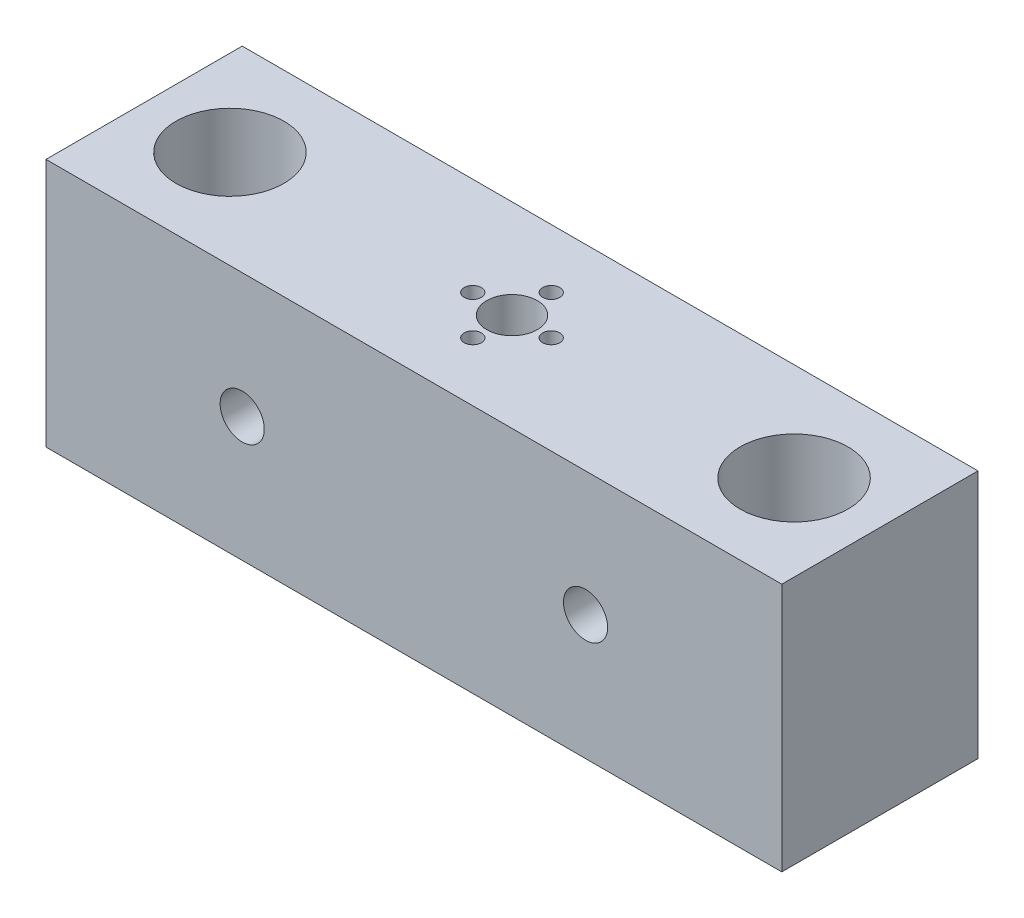
ISO-10303-21;
HEADER;
FILE_DESCRIPTION(('STEP AP214'),'2;1');
FILE_NAME('part.step','',(''),(''),'','','');
FILE_SCHEMA(('AUTOMOTIVE_DESIGN { 1 0 10303 214 1 1 1 1 }'));
ENDSEC;
DATA;
#1=APPLICATION_CONTEXT('core data for automotive mechanical design processes');
#2=APPLICATION_PROTOCOL_DEFINITION('international standard','automotive_design',2000,#1);
#3=PRODUCT_CONTEXT('',#1,'mechanical');
#4=PRODUCT('Part','Part','',(#3));
#5=PRODUCT_RELATED_PRODUCT_CATEGORY('part','',(#4));
#6=PRODUCT_DEFINITION_FORMATION('','',#4);
#7=PRODUCT_DEFINITION_CONTEXT('part definition',#1,'design');
#8=PRODUCT_DEFINITION('design','',#6,#7);
#9=PRODUCT_DEFINITION_SHAPE('','',#8);
#10=(LENGTH_UNIT() NAMED_UNIT(*) SI_UNIT(.MILLI.,.METRE.));
#11=(NAMED_UNIT(*) PLANE_ANGLE_UNIT() SI_UNIT($,.RADIAN.));
#12=(NAMED_UNIT(*) SI_UNIT($,.STERADIAN.) SOLID_ANGLE_UNIT());
#13=UNCERTAINTY_MEASURE_WITH_UNIT(LENGTH_MEASURE(1.E-05),#10,'distance_accuracy_value','');
#14=(GEOMETRIC_REPRESENTATION_CONTEXT(3) GLOBAL_UNCERTAINTY_ASSIGNED_CONTEXT((#13)) GLOBAL_UNIT_ASSIGNED_CONTEXT((#10,
#11,#12)) REPRESENTATION_CONTEXT('',''));
#15=CARTESIAN_POINT('',(0.,0.,0.));
#16=DIRECTION('',(0.,0.,1.));
#17=DIRECTION('',(1.,0.,0.));
#18=AXIS2_PLACEMENT_3D('',#15,#16,#17);
#19=CARTESIAN_POINT('',(75.,50.8,-20.));
#20=DIRECTION('',(-1.,0.,0.));
#21=DIRECTION('',(0.,0.,1.));
#22=AXIS2_PLACEMENT_3D('',#19,#20,#21);
#23=PLANE('',#22);
#24=DIRECTION('',(0.,0.,-1.));
#25=VECTOR('',#24,1.);
#26=CARTESIAN_POINT('',(75.,0.,-20.));
#27=LINE('',#26,#25);
#28=CARTESIAN_POINT('',(75.,0.,20.));
#29=VERTEX_POINT('',#28);
#30=CARTESIAN_POINT('',(75.,0.,-20.));
#31=VERTEX_POINT('',#30);
#32=EDGE_CURVE('E102',#29,#31,#27,.T.);
#33=ORIENTED_EDGE('',*,*,#32,.T.);
#34=DIRECTION('',(0.,-1.,0.));
#35=VECTOR('',#34,1.);
#36=CARTESIAN_POINT('',(75.,50.8,-20.));
#37=LINE('',#36,#35);
#38=CARTESIAN_POINT('',(75.,50.8,-20.));
#39=VERTEX_POINT('',#38);
#40=EDGE_CURVE('E11',#39,#31,#37,.T.);
#41=ORIENTED_EDGE('',*,*,#40,.F.);
#42=DIRECTION('',(0.,0.,-1.));
#43=VECTOR('',#42,1.);
#44=CARTESIAN_POINT('',(75.,50.8,-20.));
#45=LINE('',#44,#43);
#46=CARTESIAN_POINT('',(75.,50.8,20.));
#47=VERTEX_POINT('',#46);
#48=EDGE_CURVE('E90',#47,#39,#45,.T.);
#49=ORIENTED_EDGE('',*,*,#48,.F.);
#50=DIRECTION('',(0.,-1.,0.));
#51=VECTOR('',#50,1.);
#52=CARTESIAN_POINT('',(75.,50.8,20.));
#53=LINE('',#52,#51);
#54=EDGE_CURVE('E98',#47,#29,#53,.T.);
#55=ORIENTED_EDGE('',*,*,#54,.T.);
#56=EDGE_LOOP('',(#33,#41,#49,#55));
#57=FACE_BOUND('',#56,.T.);
#58=ADVANCED_FACE('F39',(#57),#23,.F.);
#59=CARTESIAN_POINT('',(-75.,50.8,-20.));
#60=DIRECTION('',(0.,0.,1.));
#61=DIRECTION('',(1.,0.,0.));
#62=AXIS2_PLACEMENT_3D('',#59,#60,#61);
#63=PLANE('',#62);
#64=CARTESIAN_POINT('',(-35.,25.4,-20.));
#65=DIRECTION('',(0.,0.,-1.));
#66=DIRECTION('',(-1.,0.,0.));
#67=AXIS2_PLACEMENT_3D('',#64,#65,#66);
#68=CIRCLE('',#67,5.025);
#69=CARTESIAN_POINT('',(-40.025,25.4,-20.));
#70=VERTEX_POINT('',#69);
#71=EDGE_CURVE('E172',#70,#70,#68,.T.);
#72=ORIENTED_EDGE('',*,*,#71,.F.);
#73=EDGE_LOOP('',(#72));
#74=FACE_BOUND('',#73,.T.);
#75=CARTESIAN_POINT('',(35.,25.4,-20.));
#76=DIRECTION('',(0.,0.,-1.));
#77=DIRECTION('',(-1.,0.,0.));
#78=AXIS2_PLACEMENT_3D('',#75,#76,#77);
#79=CIRCLE('',#78,5.025);
#80=CARTESIAN_POINT('',(29.975,25.4,-20.));
#81=VERTEX_POINT('',#80);
#82=EDGE_CURVE('E163',#81,#81,#79,.T.);
#83=ORIENTED_EDGE('',*,*,#82,.F.);
#84=EDGE_LOOP('',(#83));
#85=FACE_BOUND('',#84,.T.);
#86=DIRECTION('',(-1.,0.,0.));
#87=VECTOR('',#86,1.);
#88=CARTESIAN_POINT('',(-75.,0.,-20.));
#89=LINE('',#88,#87);
#90=CARTESIAN_POINT('',(-75.,0.,-20.));
#91=VERTEX_POINT('',#90);
#92=EDGE_CURVE('E94',#31,#91,#89,.T.);
#93=ORIENTED_EDGE('',*,*,#92,.T.);
#94=DIRECTION('',(0.,-1.,0.));
#95=VECTOR('',#94,1.);
#96=CARTESIAN_POINT('',(-75.,50.8,-20.));
#97=LINE('',#96,#95);
#98=CARTESIAN_POINT('',(-75.,50.8,-20.));
#99=VERTEX_POINT('',#98);
#100=EDGE_CURVE('E47',#99,#91,#97,.T.);
#101=ORIENTED_EDGE('',*,*,#100,.F.);
#102=DIRECTION('',(-1.,0.,0.));
#103=VECTOR('',#102,1.);
#104=CARTESIAN_POINT('',(-75.,50.8,-20.));
#105=LINE('',#104,#103);
#106=EDGE_CURVE('E85',#39,#99,#105,.T.);
#107=ORIENTED_EDGE('',*,*,#106,.F.);
#108=ORIENTED_EDGE('',*,*,#40,.T.);
#109=EDGE_LOOP('',(#93,#101,#107,#108));
#110=FACE_BOUND('',#109,.T.);
#111=ADVANCED_FACE('F93',(#74,#85,#110),#63,.F.);
#112=CARTESIAN_POINT('',(-75.,50.8,-20.));
#113=DIRECTION('',(1.,0.,0.));
#114=DIRECTION('',(0.,0.,-1.));
#115=AXIS2_PLACEMENT_3D('',#112,#113,#114);
#116=PLANE('',#115);
#117=DIRECTION('',(0.,0.,1.));
#118=VECTOR('',#117,1.);
#119=CARTESIAN_POINT('',(-75.,0.,-20.));
#120=LINE('',#119,#118);
#121=CARTESIAN_POINT('',(-75.,0.,20.));
#122=VERTEX_POINT('',#121);
#123=EDGE_CURVE('E72',#91,#122,#120,.T.);
#124=ORIENTED_EDGE('',*,*,#123,.T.);
#125=DIRECTION('',(0.,-1.,0.));
#126=VECTOR('',#125,1.);
#127=CARTESIAN_POINT('',(-75.,50.8,20.));
#128=LINE('',#127,#126);
#129=CARTESIAN_POINT('',(-75.,50.8,20.));
#130=VERTEX_POINT('',#129);
#131=EDGE_CURVE('E95',#130,#122,#128,.T.);
#132=ORIENTED_EDGE('',*,*,#131,.F.);
#133=DIRECTION('',(0.,0.,1.));
#134=VECTOR('',#133,1.);
#135=CARTESIAN_POINT('',(-75.,50.8,-20.));
#136=LINE('',#135,#134);
#137=EDGE_CURVE('E88',#99,#130,#136,.T.);
#138=ORIENTED_EDGE('',*,*,#137,.F.);
#139=ORIENTED_EDGE('',*,*,#100,.T.);
#140=EDGE_LOOP('',(#124,#132,#138,#139));
#141=FACE_BOUND('',#140,.T.);
#142=ADVANCED_FACE('F96',(#141),#116,.F.);
#143=CARTESIAN_POINT('',(-75.,50.8,20.));
#144=DIRECTION('',(0.,0.,-1.));
#145=DIRECTION('',(-1.,0.,0.));
#146=AXIS2_PLACEMENT_3D('',#143,#144,#145);
#147=PLANE('',#146);
#148=CARTESIAN_POINT('',(-35.,25.4,20.));
#149=DIRECTION('',(0.,0.,-1.));
#150=DIRECTION('',(-1.,0.,0.));
#151=AXIS2_PLACEMENT_3D('',#148,#149,#150);
#152=CIRCLE('',#151,4.49999999999998);
#153=CARTESIAN_POINT('',(-39.5,25.4,20.));
#154=VERTEX_POINT('',#153);
#155=EDGE_CURVE('E166',#154,#154,#152,.T.);
#156=ORIENTED_EDGE('',*,*,#155,.T.);
#157=EDGE_LOOP('',(#156));
#158=FACE_BOUND('',#157,.T.);
#159=CARTESIAN_POINT('',(35.,25.4,20.));
#160=DIRECTION('',(0.,0.,-1.));
#161=DIRECTION('',(-1.,0.,0.));
#162=AXIS2_PLACEMENT_3D('',#159,#160,#161);
#163=CIRCLE('',#162,4.49999999999998);
#164=CARTESIAN_POINT('',(30.5,25.4,20.));
#165=VERTEX_POINT('',#164);
#166=EDGE_CURVE('E144',#165,#165,#163,.T.);
#167=ORIENTED_EDGE('',*,*,#166,.T.);
#168=EDGE_LOOP('',(#167));
#169=FACE_BOUND('',#168,.T.);
#170=DIRECTION('',(1.,0.,0.));
#171=VECTOR('',#170,1.);
#172=CARTESIAN_POINT('',(-75.,0.,20.));
#173=LINE('',#172,#171);
#174=EDGE_CURVE('E78',#122,#29,#173,.T.);
#175=ORIENTED_EDGE('',*,*,#174,.T.);
#176=ORIENTED_EDGE('',*,*,#54,.F.);
#177=DIRECTION('',(1.,0.,0.));
#178=VECTOR('',#177,1.);
#179=CARTESIAN_POINT('',(-75.,50.8,20.));
#180=LINE('',#179,#178);
#181=EDGE_CURVE('E55',#130,#47,#180,.T.);
#182=ORIENTED_EDGE('',*,*,#181,.F.);
#183=ORIENTED_EDGE('',*,*,#131,.T.);
#184=EDGE_LOOP('',(#175,#176,#182,#183));
#185=FACE_BOUND('',#184,.T.);
#186=ADVANCED_FACE('F110',(#158,#169,#185),#147,.F.);
#187=CARTESIAN_POINT('',(0.,50.8,0.));
#188=DIRECTION('',(0.,1.,0.));
#189=DIRECTION('',(0.,0.,1.));
#190=AXIS2_PLACEMENT_3D('',#187,#188,#189);
#191=PLANE('',#190);
#192=CARTESIAN_POINT('',(8.,50.8,0.));
#193=DIRECTION('',(0.,1.,0.));
#194=DIRECTION('',(-1.,0.,0.));
#195=AXIS2_PLACEMENT_3D('',#192,#193,#194);
#196=CIRCLE('',#195,1.75);
#197=CARTESIAN_POINT('',(6.25,50.8,0.));
#198=VERTEX_POINT('',#197);
#199=EDGE_CURVE('E153',#198,#198,#196,.T.);
#200=ORIENTED_EDGE('',*,*,#199,.F.);
#201=EDGE_LOOP('',(#200));
#202=FACE_BOUND('',#201,.T.);
#203=CARTESIAN_POINT('',(0.,50.8,8.));
#204=DIRECTION('',(0.,1.,0.));
#205=DIRECTION('',(0.,0.,-1.));
#206=AXIS2_PLACEMENT_3D('',#203,#204,#205);
#207=CIRCLE('',#206,1.75);
#208=CARTESIAN_POINT('',(0.,50.8,6.25));
#209=VERTEX_POINT('',#208);
#210=EDGE_CURVE('E147',#209,#209,#207,.T.);
#211=ORIENTED_EDGE('',*,*,#210,.F.);
#212=EDGE_LOOP('',(#211));
#213=FACE_BOUND('',#212,.T.);
#214=CARTESIAN_POINT('',(-8.,50.8,0.));
#215=DIRECTION('',(0.,1.,0.));
#216=DIRECTION('',(1.,0.,0.));
#217=AXIS2_PLACEMENT_3D('',#214,#215,#216);
#218=CIRCLE('',#217,1.75);
#219=CARTESIAN_POINT('',(-6.25,50.8,0.));
#220=VERTEX_POINT('',#219);
#221=EDGE_CURVE('E140',#220,#220,#218,.T.);
#222=ORIENTED_EDGE('',*,*,#221,.F.);
#223=EDGE_LOOP('',(#222));
#224=FACE_BOUND('',#223,.T.);
#225=CARTESIAN_POINT('',(0.,50.8,-8.));
#226=DIRECTION('',(0.,1.,0.));
#227=DIRECTION('',(0.,0.,1.));
#228=AXIS2_PLACEMENT_3D('',#225,#226,#227);
#229=CIRCLE('',#228,1.75);
#230=CARTESIAN_POINT('',(0.,50.8,-6.25));
#231=VERTEX_POINT('',#230);
#232=EDGE_CURVE('E134',#231,#231,#229,.T.);
#233=ORIENTED_EDGE('',*,*,#232,.F.);
#234=EDGE_LOOP('',(#233));
#235=FACE_BOUND('',#234,.T.);
#236=CARTESIAN_POINT('',(57.5,50.8,0.));
#237=DIRECTION('',(0.,1.,0.));
#238=DIRECTION('',(0.,0.,1.));
#239=AXIS2_PLACEMENT_3D('',#236,#237,#238);
#240=CIRCLE('',#239,11.);
#241=CARTESIAN_POINT('',(57.5,50.8,11.));
#242=VERTEX_POINT('',#241);
#243=EDGE_CURVE('E128',#242,#242,#240,.T.);
#244=ORIENTED_EDGE('',*,*,#243,.F.);
#245=EDGE_LOOP('',(#244));
#246=FACE_BOUND('',#245,.T.);
#247=CARTESIAN_POINT('',(-57.5,50.8,0.));
#248=DIRECTION('',(0.,1.,0.));
#249=DIRECTION('',(0.,0.,1.));
#250=AXIS2_PLACEMENT_3D('',#247,#248,#249);
#251=CIRCLE('',#250,11.);
#252=CARTESIAN_POINT('',(-57.5,50.8,11.));
#253=VERTEX_POINT('',#252);
#254=EDGE_CURVE('E122',#253,#253,#251,.T.);
#255=ORIENTED_EDGE('',*,*,#254,.F.);
#256=EDGE_LOOP('',(#255));
#257=FACE_BOUND('',#256,.T.);
#258=CARTESIAN_POINT('',(0.,50.8,0.));
#259=DIRECTION('',(0.,1.,0.));
#260=DIRECTION('',(0.,0.,1.));
#261=AXIS2_PLACEMENT_3D('',#258,#259,#260);
#262=CIRCLE('',#261,5.15);
#263=CARTESIAN_POINT('',(0.,50.8,5.15));
#264=VERTEX_POINT('',#263);
#265=EDGE_CURVE('E116',#264,#264,#262,.T.);
#266=ORIENTED_EDGE('',*,*,#265,.F.);
#267=EDGE_LOOP('',(#266));
#268=FACE_BOUND('',#267,.T.);
#269=ORIENTED_EDGE('',*,*,#48,.T.);
#270=ORIENTED_EDGE('',*,*,#106,.T.);
#271=ORIENTED_EDGE('',*,*,#137,.T.);
#272=ORIENTED_EDGE('',*,*,#181,.T.);
#273=EDGE_LOOP('',(#269,#270,#271,#272));
#274=FACE_BOUND('',#273,.T.);
#275=ADVANCED_FACE('F86',(#202,#213,#224,#235,#246,#257,#268,#274),#191,.T.);
#276=CARTESIAN_POINT('',(0.,0.,0.));
#277=DIRECTION('',(0.,1.,0.));
#278=DIRECTION('',(0.,0.,1.));
#279=AXIS2_PLACEMENT_3D('',#276,#277,#278);
#280=PLANE('',#279);
#281=CARTESIAN_POINT('',(8.,0.,0.));
#282=DIRECTION('',(0.,1.,0.));
#283=DIRECTION('',(-1.,0.,0.));
#284=AXIS2_PLACEMENT_3D('',#281,#282,#283);
#285=CIRCLE('',#284,1.75);
#286=CARTESIAN_POINT('',(6.25,0.,0.));
#287=VERTEX_POINT('',#286);
#288=EDGE_CURVE('E137',#287,#287,#285,.T.);
#289=ORIENTED_EDGE('',*,*,#288,.T.);
#290=EDGE_LOOP('',(#289));
#291=FACE_BOUND('',#290,.T.);
#292=CARTESIAN_POINT('',(0.,0.,8.));
#293=DIRECTION('',(0.,1.,0.));
#294=DIRECTION('',(0.,0.,-1.));
#295=AXIS2_PLACEMENT_3D('',#292,#293,#294);
#296=CIRCLE('',#295,1.75);
#297=CARTESIAN_POINT('',(0.,0.,6.25));
#298=VERTEX_POINT('',#297);
#299=EDGE_CURVE('E150',#298,#298,#296,.T.);
#300=ORIENTED_EDGE('',*,*,#299,.T.);
#301=EDGE_LOOP('',(#300));
#302=FACE_BOUND('',#301,.T.);
#303=CARTESIAN_POINT('',(-8.,0.,0.));
#304=DIRECTION('',(0.,1.,0.));
#305=DIRECTION('',(1.,0.,0.));
#306=AXIS2_PLACEMENT_3D('',#303,#304,#305);
#307=CIRCLE('',#306,1.75);
#308=CARTESIAN_POINT('',(-6.25,0.,0.));
#309=VERTEX_POINT('',#308);
#310=EDGE_CURVE('E143',#309,#309,#307,.T.);
#311=ORIENTED_EDGE('',*,*,#310,.T.);
#312=EDGE_LOOP('',(#311));
#313=FACE_BOUND('',#312,.T.);
#314=CARTESIAN_POINT('',(0.,0.,-8.));
#315=DIRECTION('',(0.,1.,0.));
#316=DIRECTION('',(0.,0.,1.));
#317=AXIS2_PLACEMENT_3D('',#314,#315,#316);
#318=CIRCLE('',#317,1.75);
#319=CARTESIAN_POINT('',(0.,0.,-6.25));
#320=VERTEX_POINT('',#319);
#321=EDGE_CURVE('E131',#320,#320,#318,.T.);
#322=ORIENTED_EDGE('',*,*,#321,.T.);
#323=EDGE_LOOP('',(#322));
#324=FACE_BOUND('',#323,.T.);
#325=CARTESIAN_POINT('',(57.5,0.,0.));
#326=DIRECTION('',(0.,1.,0.));
#327=DIRECTION('',(0.,0.,1.));
#328=AXIS2_PLACEMENT_3D('',#325,#326,#327);
#329=CIRCLE('',#328,11.);
#330=CARTESIAN_POINT('',(57.5,0.,11.));
#331=VERTEX_POINT('',#330);
#332=EDGE_CURVE('E125',#331,#331,#329,.T.);
#333=ORIENTED_EDGE('',*,*,#332,.T.);
#334=EDGE_LOOP('',(#333));
#335=FACE_BOUND('',#334,.T.);
#336=CARTESIAN_POINT('',(-57.5,0.,0.));
#337=DIRECTION('',(0.,1.,0.));
#338=DIRECTION('',(0.,0.,1.));
#339=AXIS2_PLACEMENT_3D('',#336,#337,#338);
#340=CIRCLE('',#339,11.);
#341=CARTESIAN_POINT('',(-57.5,0.,11.));
#342=VERTEX_POINT('',#341);
#343=EDGE_CURVE('E119',#342,#342,#340,.T.);
#344=ORIENTED_EDGE('',*,*,#343,.T.);
#345=EDGE_LOOP('',(#344));
#346=FACE_BOUND('',#345,.T.);
#347=CARTESIAN_POINT('',(0.,0.,0.));
#348=DIRECTION('',(0.,1.,0.));
#349=DIRECTION('',(0.,0.,1.));
#350=AXIS2_PLACEMENT_3D('',#347,#348,#349);
#351=CIRCLE('',#350,5.15);
#352=CARTESIAN_POINT('',(0.,0.,5.15));
#353=VERTEX_POINT('',#352);
#354=EDGE_CURVE('E105',#353,#353,#351,.T.);
#355=ORIENTED_EDGE('',*,*,#354,.T.);
#356=EDGE_LOOP('',(#355));
#357=FACE_BOUND('',#356,.T.);
#358=ORIENTED_EDGE('',*,*,#32,.F.);
#359=ORIENTED_EDGE('',*,*,#174,.F.);
#360=ORIENTED_EDGE('',*,*,#123,.F.);
#361=ORIENTED_EDGE('',*,*,#92,.F.);
#362=EDGE_LOOP('',(#358,#359,#360,#361));
#363=FACE_BOUND('',#362,.T.);
#364=ADVANCED_FACE('F113',(#291,#302,#313,#324,#335,#346,#357,#363),#280,.F.);
#365=CARTESIAN_POINT('',(0.,0.,0.));
#366=DIRECTION('',(0.,1.,0.));
#367=DIRECTION('',(0.,0.,1.));
#368=AXIS2_PLACEMENT_3D('',#365,#366,#367);
#369=CYLINDRICAL_SURFACE('',#368,5.15);
#370=ORIENTED_EDGE('',*,*,#354,.F.);
#371=EDGE_LOOP('',(#370));
#372=FACE_BOUND('',#371,.T.);
#373=ORIENTED_EDGE('',*,*,#265,.T.);
#374=EDGE_LOOP('',(#373));
#375=FACE_BOUND('',#374,.T.);
#376=ADVANCED_FACE('F235',(#372,#375),#369,.F.);
#377=CARTESIAN_POINT('',(-57.5,0.,0.));
#378=DIRECTION('',(0.,1.,0.));
#379=DIRECTION('',(0.,0.,1.));
#380=AXIS2_PLACEMENT_3D('',#377,#378,#379);
#381=CYLINDRICAL_SURFACE('',#380,11.);
#382=ORIENTED_EDGE('',*,*,#343,.F.);
#383=EDGE_LOOP('',(#382));
#384=FACE_BOUND('',#383,.T.);
#385=ORIENTED_EDGE('',*,*,#254,.T.);
#386=EDGE_LOOP('',(#385));
#387=FACE_BOUND('',#386,.T.);
#388=ADVANCED_FACE('F243',(#384,#387),#381,.F.);
#389=CARTESIAN_POINT('',(57.5,0.,0.));
#390=DIRECTION('',(0.,1.,0.));
#391=DIRECTION('',(0.,0.,1.));
#392=AXIS2_PLACEMENT_3D('',#389,#390,#391);
#393=CYLINDRICAL_SURFACE('',#392,11.);
#394=ORIENTED_EDGE('',*,*,#332,.F.);
#395=EDGE_LOOP('',(#394));
#396=FACE_BOUND('',#395,.T.);
#397=ORIENTED_EDGE('',*,*,#243,.T.);
#398=EDGE_LOOP('',(#397));
#399=FACE_BOUND('',#398,.T.);
#400=ADVANCED_FACE('F251',(#396,#399),#393,.F.);
#401=CARTESIAN_POINT('',(0.,0.,-8.));
#402=DIRECTION('',(0.,1.,0.));
#403=DIRECTION('',(0.,0.,1.));
#404=AXIS2_PLACEMENT_3D('',#401,#402,#403);
#405=CYLINDRICAL_SURFACE('',#404,1.75);
#406=ORIENTED_EDGE('',*,*,#321,.F.);
#407=EDGE_LOOP('',(#406));
#408=FACE_BOUND('',#407,.T.);
#409=ORIENTED_EDGE('',*,*,#232,.T.);
#410=EDGE_LOOP('',(#409));
#411=FACE_BOUND('',#410,.T.);
#412=ADVANCED_FACE('F259',(#408,#411),#405,.F.);
#413=CARTESIAN_POINT('',(-8.,0.,0.));
#414=DIRECTION('',(0.,1.,0.));
#415=DIRECTION('',(0.,0.,1.));
#416=AXIS2_PLACEMENT_3D('',#413,#414,#415);
#417=CYLINDRICAL_SURFACE('',#416,1.75);
#418=ORIENTED_EDGE('',*,*,#310,.F.);
#419=EDGE_LOOP('',(#418));
#420=FACE_BOUND('',#419,.T.);
#421=ORIENTED_EDGE('',*,*,#221,.T.);
#422=EDGE_LOOP('',(#421));
#423=FACE_BOUND('',#422,.T.);
#424=ADVANCED_FACE('F266',(#420,#423),#417,.F.);
#425=CARTESIAN_POINT('',(0.,0.,8.));
#426=DIRECTION('',(0.,1.,0.));
#427=DIRECTION('',(0.,0.,1.));
#428=AXIS2_PLACEMENT_3D('',#425,#426,#427);
#429=CYLINDRICAL_SURFACE('',#428,1.75);
#430=ORIENTED_EDGE('',*,*,#299,.F.);
#431=EDGE_LOOP('',(#430));
#432=FACE_BOUND('',#431,.T.);
#433=ORIENTED_EDGE('',*,*,#210,.T.);
#434=EDGE_LOOP('',(#433));
#435=FACE_BOUND('',#434,.T.);
#436=ADVANCED_FACE('F273',(#432,#435),#429,.F.);
#437=CARTESIAN_POINT('',(8.,0.,0.));
#438=DIRECTION('',(0.,1.,0.));
#439=DIRECTION('',(0.,0.,1.));
#440=AXIS2_PLACEMENT_3D('',#437,#438,#439);
#441=CYLINDRICAL_SURFACE('',#440,1.75);
#442=ORIENTED_EDGE('',*,*,#288,.F.);
#443=EDGE_LOOP('',(#442));
#444=FACE_BOUND('',#443,.T.);
#445=ORIENTED_EDGE('',*,*,#199,.T.);
#446=EDGE_LOOP('',(#445));
#447=FACE_BOUND('',#446,.T.);
#448=ADVANCED_FACE('F194',(#444,#447),#441,.F.);
#449=CARTESIAN_POINT('',(35.,25.4,-20.));
#450=DIRECTION('',(0.,0.,-1.));
#451=DIRECTION('',(-1.,0.,0.));
#452=AXIS2_PLACEMENT_3D('',#449,#450,#451);
#453=CYLINDRICAL_SURFACE('',#452,4.49999999999999);
#454=ORIENTED_EDGE('',*,*,#166,.F.);
#455=EDGE_LOOP('',(#454));
#456=FACE_BOUND('',#455,.T.);
#457=CARTESIAN_POINT('',(35.,25.4,-19.475));
#458=DIRECTION('',(0.,0.,-1.));
#459=DIRECTION('',(-1.,0.,0.));
#460=AXIS2_PLACEMENT_3D('',#457,#458,#459);
#461=CIRCLE('',#460,4.49999999999999);
#462=CARTESIAN_POINT('',(30.5,25.4,-19.475));
#463=VERTEX_POINT('',#462);
#464=EDGE_CURVE('E160',#463,#463,#461,.T.);
#465=ORIENTED_EDGE('',*,*,#464,.T.);
#466=EDGE_LOOP('',(#465));
#467=FACE_BOUND('',#466,.T.);
#468=ADVANCED_FACE('F185',(#456,#467),#453,.F.);
#469=CARTESIAN_POINT('',(35.,25.4,-20.));
#470=DIRECTION('',(0.,0.,-1.));
#471=DIRECTION('',(-1.,0.,0.));
#472=AXIS2_PLACEMENT_3D('',#469,#470,#471);
#473=CONICAL_SURFACE('',#472,5.025,0.785398163397458);
#474=ORIENTED_EDGE('',*,*,#464,.F.);
#475=EDGE_LOOP('',(#474));
#476=FACE_BOUND('',#475,.T.);
#477=ORIENTED_EDGE('',*,*,#82,.T.);
#478=EDGE_LOOP('',(#477));
#479=FACE_BOUND('',#478,.T.);
#480=ADVANCED_FACE('F182',(#476,#479),#473,.F.);
#481=CARTESIAN_POINT('',(-35.,25.4,-20.));
#482=DIRECTION('',(0.,0.,-1.));
#483=DIRECTION('',(-1.,0.,0.));
#484=AXIS2_PLACEMENT_3D('',#481,#482,#483);
#485=CYLINDRICAL_SURFACE('',#484,4.49999999999999);
#486=ORIENTED_EDGE('',*,*,#155,.F.);
#487=EDGE_LOOP('',(#486));
#488=FACE_BOUND('',#487,.T.);
#489=CARTESIAN_POINT('',(-35.,25.4,-19.475));
#490=DIRECTION('',(0.,0.,-1.));
#491=DIRECTION('',(-1.,0.,0.));
#492=AXIS2_PLACEMENT_3D('',#489,#490,#491);
#493=CIRCLE('',#492,4.49999999999999);
#494=CARTESIAN_POINT('',(-39.5,25.4,-19.475));
#495=VERTEX_POINT('',#494);
#496=EDGE_CURVE('E169',#495,#495,#493,.T.);
#497=ORIENTED_EDGE('',*,*,#496,.T.);
#498=EDGE_LOOP('',(#497));
#499=FACE_BOUND('',#498,.T.);
#500=ADVANCED_FACE('F184',(#488,#499),#485,.F.);
#501=CARTESIAN_POINT('',(-35.,25.4,-20.));
#502=DIRECTION('',(0.,0.,-1.));
#503=DIRECTION('',(-1.,0.,0.));
#504=AXIS2_PLACEMENT_3D('',#501,#502,#503);
#505=CONICAL_SURFACE('',#504,5.025,0.785398163397458);
#506=ORIENTED_EDGE('',*,*,#496,.F.);
#507=EDGE_LOOP('',(#506));
#508=FACE_BOUND('',#507,.T.);
#509=ORIENTED_EDGE('',*,*,#71,.T.);
#510=EDGE_LOOP('',(#509));
#511=FACE_BOUND('',#510,.T.);
#512=ADVANCED_FACE('F176',(#508,#511),#505,.F.);
#513=CLOSED_SHELL('',(#58,#111,#142,#186,#275,#364,#376,#388,#400,#412,#424,#436,#448,#468,#480,
#500,#512));
#514=MANIFOLD_SOLID_BREP('B2',#513);
#515=ADVANCED_BREP_SHAPE_REPRESENTATION('',(#18,#514),#14);
#516=SHAPE_DEFINITION_REPRESENTATION(#9,#515);
ENDSEC;
END-ISO-10303-21;
